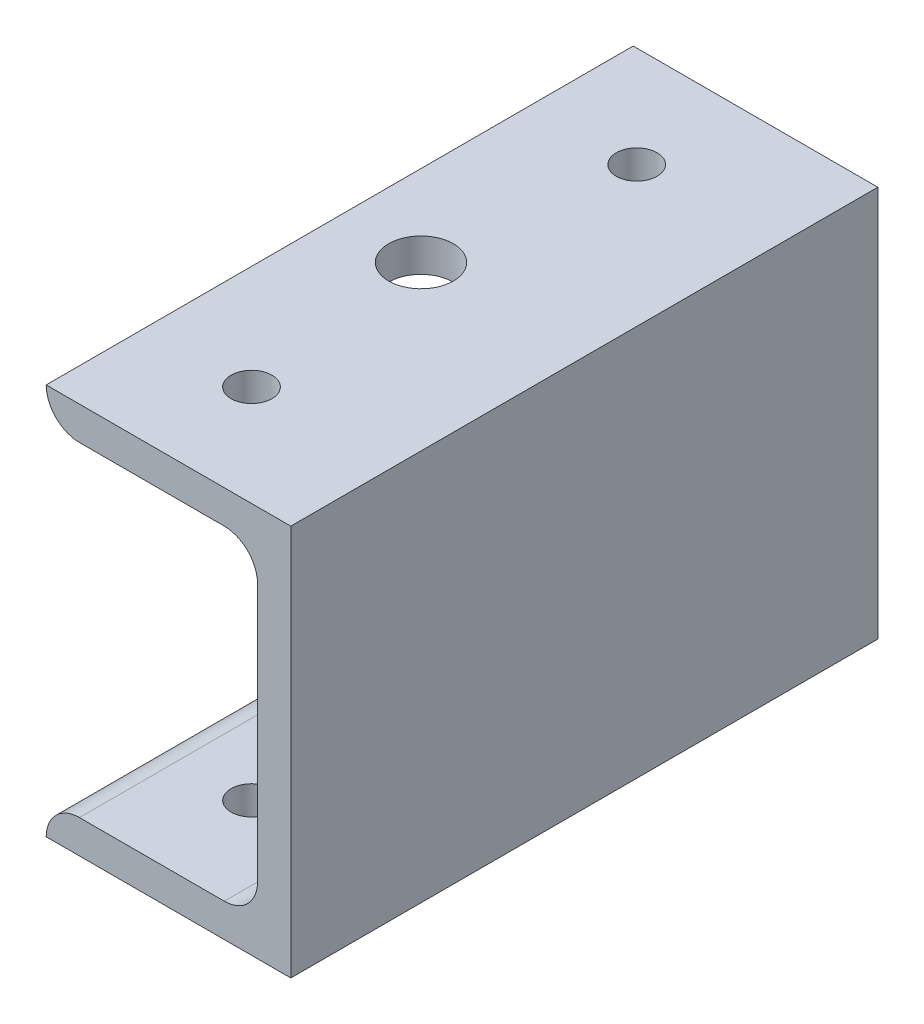
ISO-10303-21;
HEADER;
FILE_DESCRIPTION(('STEP AP214'),'2;1');
FILE_NAME('part.step','',(''),(''),'','','');
FILE_SCHEMA(('AUTOMOTIVE_DESIGN { 1 0 10303 214 1 1 1 1 }'));
ENDSEC;
DATA;
#1=APPLICATION_CONTEXT('core data for automotive mechanical design processes');
#2=APPLICATION_PROTOCOL_DEFINITION('international standard','automotive_design',2000,#1);
#3=PRODUCT_CONTEXT('',#1,'mechanical');
#4=PRODUCT('Part','Part','',(#3));
#5=PRODUCT_RELATED_PRODUCT_CATEGORY('part','',(#4));
#6=PRODUCT_DEFINITION_FORMATION('','',#4);
#7=PRODUCT_DEFINITION_CONTEXT('part definition',#1,'design');
#8=PRODUCT_DEFINITION('design','',#6,#7);
#9=PRODUCT_DEFINITION_SHAPE('','',#8);
#10=(LENGTH_UNIT() NAMED_UNIT(*) SI_UNIT(.MILLI.,.METRE.));
#11=(NAMED_UNIT(*) PLANE_ANGLE_UNIT() SI_UNIT($,.RADIAN.));
#12=(NAMED_UNIT(*) SI_UNIT($,.STERADIAN.) SOLID_ANGLE_UNIT());
#13=UNCERTAINTY_MEASURE_WITH_UNIT(LENGTH_MEASURE(1.E-05),#10,'distance_accuracy_value','');
#14=(GEOMETRIC_REPRESENTATION_CONTEXT(3) GLOBAL_UNCERTAINTY_ASSIGNED_CONTEXT((#13)) GLOBAL_UNIT_ASSIGNED_CONTEXT((#10,
#11,#12)) REPRESENTATION_CONTEXT('',''));
#15=CARTESIAN_POINT('',(0.,0.,0.));
#16=DIRECTION('',(0.,0.,1.));
#17=DIRECTION('',(1.,0.,0.));
#18=AXIS2_PLACEMENT_3D('',#15,#16,#17);
#19=CARTESIAN_POINT('',(-101.6,-100.710476364399,38.1));
#20=DIRECTION('',(0.,1.,0.));
#21=DIRECTION('',(-1.,0.,0.));
#22=AXIS2_PLACEMENT_3D('',#19,#20,#21);
#23=PLANE('',#22);
#24=CARTESIAN_POINT('',(-88.05,-100.710476364399,-25.));
#25=DIRECTION('',(0.,-1.,0.));
#26=DIRECTION('',(0.,0.,-1.));
#27=AXIS2_PLACEMENT_3D('',#24,#25,#26);
#28=CIRCLE('',#27,2.64999999999999);
#29=CARTESIAN_POINT('',(-88.05,-100.710476364399,-27.65));
#30=VERTEX_POINT('',#29);
#31=EDGE_CURVE('E249',#30,#30,#28,.T.);
#32=ORIENTED_EDGE('',*,*,#31,.F.);
#33=EDGE_LOOP('',(#32));
#34=FACE_BOUND('',#33,.T.);
#35=CARTESIAN_POINT('',(-88.05,-100.710476364399,25.));
#36=DIRECTION('',(0.,-1.,0.));
#37=DIRECTION('',(0.,0.,-1.));
#38=AXIS2_PLACEMENT_3D('',#35,#36,#37);
#39=CIRCLE('',#38,2.64999999999999);
#40=CARTESIAN_POINT('',(-88.05,-100.710476364399,22.35));
#41=VERTEX_POINT('',#40);
#42=EDGE_CURVE('E243',#41,#41,#39,.T.);
#43=ORIENTED_EDGE('',*,*,#42,.F.);
#44=EDGE_LOOP('',(#43));
#45=FACE_BOUND('',#44,.T.);
#46=CARTESIAN_POINT('',(-91.05,-100.710476364399,0.));
#47=DIRECTION('',(0.,-1.,0.));
#48=DIRECTION('',(0.,0.,-1.));
#49=AXIS2_PLACEMENT_3D('',#46,#47,#48);
#50=CIRCLE('',#49,2.64999999999999);
#51=CARTESIAN_POINT('',(-91.05,-100.710476364399,-2.64999999999995));
#52=VERTEX_POINT('',#51);
#53=EDGE_CURVE('E237',#52,#52,#50,.T.);
#54=ORIENTED_EDGE('',*,*,#53,.F.);
#55=EDGE_LOOP('',(#54));
#56=FACE_BOUND('',#55,.T.);
#57=DIRECTION('',(1.,0.,0.));
#58=VECTOR('',#57,1.);
#59=CARTESIAN_POINT('',(-101.6,-100.710476364399,-38.1));
#60=LINE('',#59,#58);
#61=CARTESIAN_POINT('',(-101.6,-100.710476364399,-38.1));
#62=VERTEX_POINT('',#61);
#63=CARTESIAN_POINT('',(-69.85,-100.710476364399,-38.1));
#64=VERTEX_POINT('',#63);
#65=EDGE_CURVE('E184',#62,#64,#60,.T.);
#66=ORIENTED_EDGE('',*,*,#65,.T.);
#67=DIRECTION('',(0.,0.,-1.));
#68=VECTOR('',#67,1.);
#69=CARTESIAN_POINT('',(-69.85,-100.710476364399,38.1));
#70=LINE('',#69,#68);
#71=CARTESIAN_POINT('',(-69.85,-100.710476364399,38.1));
#72=VERTEX_POINT('',#71);
#73=EDGE_CURVE('E125',#72,#64,#70,.T.);
#74=ORIENTED_EDGE('',*,*,#73,.F.);
#75=DIRECTION('',(1.,0.,0.));
#76=VECTOR('',#75,1.);
#77=CARTESIAN_POINT('',(-101.6,-100.710476364399,38.1));
#78=LINE('',#77,#76);
#79=CARTESIAN_POINT('',(-101.6,-100.710476364399,38.1));
#80=VERTEX_POINT('',#79);
#81=EDGE_CURVE('E113',#80,#72,#78,.T.);
#82=ORIENTED_EDGE('',*,*,#81,.F.);
#83=DIRECTION('',(0.,0.,-1.));
#84=VECTOR('',#83,1.);
#85=CARTESIAN_POINT('',(-101.6,-100.710476364399,38.1));
#86=LINE('',#85,#84);
#87=EDGE_CURVE('E123',#80,#62,#86,.T.);
#88=ORIENTED_EDGE('',*,*,#87,.T.);
#89=EDGE_LOOP('',(#66,#74,#82,#88));
#90=FACE_BOUND('',#89,.T.);
#91=ADVANCED_FACE('F35',(#34,#45,#56,#90),#23,.F.);
#92=CARTESIAN_POINT('',(-69.85,-100.710476364399,38.1));
#93=DIRECTION('',(-1.,0.,0.));
#94=DIRECTION('',(0.,-1.,0.));
#95=AXIS2_PLACEMENT_3D('',#92,#93,#94);
#96=PLANE('',#95);
#97=DIRECTION('',(0.,1.,0.));
#98=VECTOR('',#97,1.);
#99=CARTESIAN_POINT('',(-69.85,-100.710476364399,-38.1));
#100=LINE('',#99,#98);
#101=CARTESIAN_POINT('',(-69.85,-49.9104763643993,-38.1));
#102=VERTEX_POINT('',#101);
#103=EDGE_CURVE('E186',#64,#102,#100,.T.);
#104=ORIENTED_EDGE('',*,*,#103,.T.);
#105=DIRECTION('',(0.,0.,-1.));
#106=VECTOR('',#105,1.);
#107=CARTESIAN_POINT('',(-69.85,-49.9104763643993,38.1));
#108=LINE('',#107,#106);
#109=CARTESIAN_POINT('',(-69.85,-49.9104763643993,38.1));
#110=VERTEX_POINT('',#109);
#111=EDGE_CURVE('E137',#110,#102,#108,.T.);
#112=ORIENTED_EDGE('',*,*,#111,.F.);
#113=DIRECTION('',(0.,1.,0.));
#114=VECTOR('',#113,1.);
#115=CARTESIAN_POINT('',(-69.85,-100.710476364399,38.1));
#116=LINE('',#115,#114);
#117=EDGE_CURVE('E127',#72,#110,#116,.T.);
#118=ORIENTED_EDGE('',*,*,#117,.F.);
#119=ORIENTED_EDGE('',*,*,#73,.T.);
#120=EDGE_LOOP('',(#104,#112,#118,#119));
#121=FACE_BOUND('',#120,.T.);
#122=ADVANCED_FACE('F257',(#121),#96,.F.);
#123=CARTESIAN_POINT('',(-69.85,-49.9104763643993,38.1));
#124=DIRECTION('',(0.,-1.,0.));
#125=DIRECTION('',(0.,0.,-1.));
#126=AXIS2_PLACEMENT_3D('',#123,#124,#125);
#127=PLANE('',#126);
#128=CARTESIAN_POINT('',(-88.05,-49.9104763643993,25.));
#129=DIRECTION('',(0.,1.,0.));
#130=DIRECTION('',(0.,0.,1.));
#131=AXIS2_PLACEMENT_3D('',#128,#129,#130);
#132=CIRCLE('',#131,2.64999999999999);
#133=CARTESIAN_POINT('',(-88.05,-49.9104763643993,27.65));
#134=VERTEX_POINT('',#133);
#135=EDGE_CURVE('E231',#134,#134,#132,.T.);
#136=ORIENTED_EDGE('',*,*,#135,.F.);
#137=EDGE_LOOP('',(#136));
#138=FACE_BOUND('',#137,.T.);
#139=CARTESIAN_POINT('',(-88.05,-49.9104763643993,-25.));
#140=DIRECTION('',(0.,1.,0.));
#141=DIRECTION('',(0.,0.,1.));
#142=AXIS2_PLACEMENT_3D('',#139,#140,#141);
#143=CIRCLE('',#142,2.64999999999999);
#144=CARTESIAN_POINT('',(-88.05,-49.9104763643993,-22.35));
#145=VERTEX_POINT('',#144);
#146=EDGE_CURVE('E225',#145,#145,#143,.T.);
#147=ORIENTED_EDGE('',*,*,#146,.F.);
#148=EDGE_LOOP('',(#147));
#149=FACE_BOUND('',#148,.T.);
#150=CARTESIAN_POINT('',(-91.05,-49.9104763643993,0.));
#151=DIRECTION('',(0.,-1.,0.));
#152=DIRECTION('',(0.,0.,-1.));
#153=AXIS2_PLACEMENT_3D('',#150,#151,#152);
#154=CIRCLE('',#153,4.2);
#155=CARTESIAN_POINT('',(-91.05,-49.9104763643993,4.19999999999999));
#156=VERTEX_POINT('',#155);
#157=EDGE_CURVE('E187',#156,#156,#154,.T.);
#158=ORIENTED_EDGE('',*,*,#157,.T.);
#159=EDGE_LOOP('',(#158));
#160=FACE_BOUND('',#159,.T.);
#161=DIRECTION('',(-1.,0.,0.));
#162=VECTOR('',#161,1.);
#163=CARTESIAN_POINT('',(-69.85,-49.9104763643993,-38.1));
#164=LINE('',#163,#162);
#165=CARTESIAN_POINT('',(-101.6,-49.9104763643993,-38.1));
#166=VERTEX_POINT('',#165);
#167=EDGE_CURVE('E189',#102,#166,#164,.T.);
#168=ORIENTED_EDGE('',*,*,#167,.T.);
#169=DIRECTION('',(0.,0.,-1.));
#170=VECTOR('',#169,1.);
#171=CARTESIAN_POINT('',(-101.6,-49.9104763643993,38.1));
#172=LINE('',#171,#170);
#173=CARTESIAN_POINT('',(-101.6,-49.9104763643993,38.1));
#174=VERTEX_POINT('',#173);
#175=EDGE_CURVE('E175',#174,#166,#172,.T.);
#176=ORIENTED_EDGE('',*,*,#175,.F.);
#177=DIRECTION('',(-1.,0.,0.));
#178=VECTOR('',#177,1.);
#179=CARTESIAN_POINT('',(-69.85,-49.9104763643993,38.1));
#180=LINE('',#179,#178);
#181=EDGE_CURVE('E201',#110,#174,#180,.T.);
#182=ORIENTED_EDGE('',*,*,#181,.F.);
#183=ORIENTED_EDGE('',*,*,#111,.T.);
#184=EDGE_LOOP('',(#168,#176,#182,#183));
#185=FACE_BOUND('',#184,.T.);
#186=ADVANCED_FACE('F199',(#138,#149,#160,#185),#127,.F.);
#187=CARTESIAN_POINT('',(-74.168,-54.2284763643993,38.1));
#188=DIRECTION('',(0.,1.,0.));
#189=DIRECTION('',(-1.,0.,0.));
#190=AXIS2_PLACEMENT_3D('',#187,#188,#189);
#191=PLANE('',#190);
#192=CARTESIAN_POINT('',(-88.05,-54.2284763643993,25.));
#193=DIRECTION('',(0.,1.,0.));
#194=DIRECTION('',(0.,0.,1.));
#195=AXIS2_PLACEMENT_3D('',#192,#193,#194);
#196=CIRCLE('',#195,2.64999999999999);
#197=CARTESIAN_POINT('',(-88.05,-54.2284763643993,27.65));
#198=VERTEX_POINT('',#197);
#199=EDGE_CURVE('E228',#198,#198,#196,.T.);
#200=ORIENTED_EDGE('',*,*,#199,.T.);
#201=EDGE_LOOP('',(#200));
#202=FACE_BOUND('',#201,.T.);
#203=CARTESIAN_POINT('',(-88.05,-54.2284763643993,-25.));
#204=DIRECTION('',(0.,1.,0.));
#205=DIRECTION('',(0.,0.,1.));
#206=AXIS2_PLACEMENT_3D('',#203,#204,#205);
#207=CIRCLE('',#206,2.64999999999999);
#208=CARTESIAN_POINT('',(-88.05,-54.2284763643993,-22.35));
#209=VERTEX_POINT('',#208);
#210=EDGE_CURVE('E222',#209,#209,#207,.T.);
#211=ORIENTED_EDGE('',*,*,#210,.T.);
#212=EDGE_LOOP('',(#211));
#213=FACE_BOUND('',#212,.T.);
#214=CARTESIAN_POINT('',(-91.05,-54.2284763643993,0.));
#215=DIRECTION('',(0.,1.,0.));
#216=DIRECTION('',(-1.,0.,0.));
#217=AXIS2_PLACEMENT_3D('',#214,#215,#216);
#218=CIRCLE('',#217,4.2);
#219=CARTESIAN_POINT('',(-91.05,-54.2284763643993,4.19999999999999));
#220=VERTEX_POINT('',#219);
#221=EDGE_CURVE('E219',#220,#220,#218,.F.);
#222=ORIENTED_EDGE('',*,*,#221,.F.);
#223=EDGE_LOOP('',(#222));
#224=FACE_BOUND('',#223,.T.);
#225=DIRECTION('',(1.,0.,0.));
#226=VECTOR('',#225,1.);
#227=CARTESIAN_POINT('',(-74.168,-54.2284763643993,38.1));
#228=LINE('',#227,#226);
#229=CARTESIAN_POINT('',(-97.282,-54.2284763643993,38.1));
#230=VERTEX_POINT('',#229);
#231=CARTESIAN_POINT('',(-78.486,-54.2284763643993,38.1));
#232=VERTEX_POINT('',#231);
#233=EDGE_CURVE('E180',#230,#232,#228,.T.);
#234=ORIENTED_EDGE('',*,*,#233,.F.);
#235=DIRECTION('',(0.,0.,-1.));
#236=VECTOR('',#235,1.);
#237=CARTESIAN_POINT('',(-97.282,-54.2284763643993,38.1));
#238=LINE('',#237,#236);
#239=CARTESIAN_POINT('',(-97.282,-54.2284763643993,-38.1));
#240=VERTEX_POINT('',#239);
#241=EDGE_CURVE('E135',#230,#240,#238,.T.);
#242=ORIENTED_EDGE('',*,*,#241,.T.);
#243=DIRECTION('',(1.,0.,0.));
#244=VECTOR('',#243,1.);
#245=CARTESIAN_POINT('',(-74.168,-54.2284763643993,-38.1));
#246=LINE('',#245,#244);
#247=CARTESIAN_POINT('',(-78.486,-54.2284763643993,-38.1));
#248=VERTEX_POINT('',#247);
#249=EDGE_CURVE('E172',#240,#248,#246,.T.);
#250=ORIENTED_EDGE('',*,*,#249,.T.);
#251=DIRECTION('',(0.,0.,-1.));
#252=VECTOR('',#251,1.);
#253=CARTESIAN_POINT('',(-78.486,-54.2284763643993,38.1));
#254=LINE('',#253,#252);
#255=EDGE_CURVE('E133',#248,#232,#254,.F.);
#256=ORIENTED_EDGE('',*,*,#255,.T.);
#257=EDGE_LOOP('',(#234,#242,#250,#256));
#258=FACE_BOUND('',#257,.T.);
#259=ADVANCED_FACE('F210',(#202,#213,#224,#258),#191,.F.);
#260=CARTESIAN_POINT('',(-74.168,-96.3924763643993,38.1));
#261=DIRECTION('',(1.,0.,0.));
#262=DIRECTION('',(0.,0.,-1.));
#263=AXIS2_PLACEMENT_3D('',#260,#261,#262);
#264=PLANE('',#263);
#265=DIRECTION('',(0.,-1.,0.));
#266=VECTOR('',#265,1.);
#267=CARTESIAN_POINT('',(-74.168,-96.3924763643993,38.1));
#268=LINE('',#267,#266);
#269=CARTESIAN_POINT('',(-74.168,-58.5464763643993,38.1));
#270=VERTEX_POINT('',#269);
#271=CARTESIAN_POINT('',(-74.168,-92.0744763643993,38.1));
#272=VERTEX_POINT('',#271);
#273=EDGE_CURVE('E176',#270,#272,#268,.T.);
#274=ORIENTED_EDGE('',*,*,#273,.F.);
#275=DIRECTION('',(0.,0.,-1.));
#276=VECTOR('',#275,1.);
#277=CARTESIAN_POINT('',(-74.168,-58.5464763643993,-38.1));
#278=LINE('',#277,#276);
#279=CARTESIAN_POINT('',(-74.168,-58.5464763643993,-38.1));
#280=VERTEX_POINT('',#279);
#281=EDGE_CURVE('E152',#270,#280,#278,.T.);
#282=ORIENTED_EDGE('',*,*,#281,.T.);
#283=DIRECTION('',(0.,-1.,0.));
#284=VECTOR('',#283,1.);
#285=CARTESIAN_POINT('',(-74.168,-96.3924763643993,-38.1));
#286=LINE('',#285,#284);
#287=CARTESIAN_POINT('',(-74.168,-92.0744763643993,-38.1));
#288=VERTEX_POINT('',#287);
#289=EDGE_CURVE('E164',#280,#288,#286,.T.);
#290=ORIENTED_EDGE('',*,*,#289,.T.);
#291=DIRECTION('',(0.,0.,-1.));
#292=VECTOR('',#291,1.);
#293=CARTESIAN_POINT('',(-74.168,-92.0744763643993,38.1));
#294=LINE('',#293,#292);
#295=EDGE_CURVE('E150',#288,#272,#294,.F.);
#296=ORIENTED_EDGE('',*,*,#295,.T.);
#297=EDGE_LOOP('',(#274,#282,#290,#296));
#298=FACE_BOUND('',#297,.T.);
#299=ADVANCED_FACE('F170',(#298),#264,.F.);
#300=CARTESIAN_POINT('',(-101.6,-96.3924763643993,38.1));
#301=DIRECTION('',(0.,-1.,0.));
#302=DIRECTION('',(0.,0.,-1.));
#303=AXIS2_PLACEMENT_3D('',#300,#301,#302);
#304=PLANE('',#303);
#305=CARTESIAN_POINT('',(-88.05,-96.3924763643993,-25.));
#306=DIRECTION('',(0.,-1.,0.));
#307=DIRECTION('',(0.,0.,-1.));
#308=AXIS2_PLACEMENT_3D('',#305,#306,#307);
#309=CIRCLE('',#308,2.64999999999999);
#310=CARTESIAN_POINT('',(-88.05,-96.3924763643993,-27.65));
#311=VERTEX_POINT('',#310);
#312=EDGE_CURVE('E246',#311,#311,#309,.T.);
#313=ORIENTED_EDGE('',*,*,#312,.T.);
#314=EDGE_LOOP('',(#313));
#315=FACE_BOUND('',#314,.T.);
#316=CARTESIAN_POINT('',(-88.05,-96.3924763643993,25.));
#317=DIRECTION('',(0.,-1.,0.));
#318=DIRECTION('',(0.,0.,-1.));
#319=AXIS2_PLACEMENT_3D('',#316,#317,#318);
#320=CIRCLE('',#319,2.64999999999999);
#321=CARTESIAN_POINT('',(-88.05,-96.3924763643993,22.35));
#322=VERTEX_POINT('',#321);
#323=EDGE_CURVE('E240',#322,#322,#320,.T.);
#324=ORIENTED_EDGE('',*,*,#323,.T.);
#325=EDGE_LOOP('',(#324));
#326=FACE_BOUND('',#325,.T.);
#327=CARTESIAN_POINT('',(-91.05,-96.3924763643993,0.));
#328=DIRECTION('',(0.,-1.,0.));
#329=DIRECTION('',(0.,0.,-1.));
#330=AXIS2_PLACEMENT_3D('',#327,#328,#329);
#331=CIRCLE('',#330,2.64999999999999);
#332=CARTESIAN_POINT('',(-91.05,-96.3924763643993,-2.64999999999995));
#333=VERTEX_POINT('',#332);
#334=EDGE_CURVE('E234',#333,#333,#331,.T.);
#335=ORIENTED_EDGE('',*,*,#334,.T.);
#336=EDGE_LOOP('',(#335));
#337=FACE_BOUND('',#336,.T.);
#338=DIRECTION('',(-1.,0.,0.));
#339=VECTOR('',#338,1.);
#340=CARTESIAN_POINT('',(-101.6,-96.3924763643993,-38.1));
#341=LINE('',#340,#339);
#342=CARTESIAN_POINT('',(-78.486,-96.3924763643993,-38.1));
#343=VERTEX_POINT('',#342);
#344=CARTESIAN_POINT('',(-97.282,-96.3924763643993,-38.1));
#345=VERTEX_POINT('',#344);
#346=EDGE_CURVE('E128',#343,#345,#341,.T.);
#347=ORIENTED_EDGE('',*,*,#346,.T.);
#348=DIRECTION('',(0.,0.,-1.));
#349=VECTOR('',#348,1.);
#350=CARTESIAN_POINT('',(-97.282,-96.3924763643993,38.1));
#351=LINE('',#350,#349);
#352=CARTESIAN_POINT('',(-97.282,-96.3924763643993,38.1));
#353=VERTEX_POINT('',#352);
#354=EDGE_CURVE('E50',#345,#353,#351,.F.);
#355=ORIENTED_EDGE('',*,*,#354,.T.);
#356=DIRECTION('',(-1.,0.,0.));
#357=VECTOR('',#356,1.);
#358=CARTESIAN_POINT('',(-101.6,-96.3924763643993,38.1));
#359=LINE('',#358,#357);
#360=CARTESIAN_POINT('',(-78.486,-96.3924763643993,38.1));
#361=VERTEX_POINT('',#360);
#362=EDGE_CURVE('E115',#361,#353,#359,.T.);
#363=ORIENTED_EDGE('',*,*,#362,.F.);
#364=DIRECTION('',(0.,0.,-1.));
#365=VECTOR('',#364,1.);
#366=CARTESIAN_POINT('',(-78.486,-96.3924763643993,-38.1));
#367=LINE('',#366,#365);
#368=EDGE_CURVE('E146',#361,#343,#367,.T.);
#369=ORIENTED_EDGE('',*,*,#368,.T.);
#370=EDGE_LOOP('',(#347,#355,#363,#369));
#371=FACE_BOUND('',#370,.T.);
#372=ADVANCED_FACE('F174',(#315,#326,#337,#371),#304,.F.);
#373=CARTESIAN_POINT('',(0.,0.,38.1));
#374=DIRECTION('',(0.,0.,-1.));
#375=DIRECTION('',(-1.,0.,0.));
#376=AXIS2_PLACEMENT_3D('',#373,#374,#375);
#377=PLANE('',#376);
#378=ORIENTED_EDGE('',*,*,#181,.T.);
#379=CARTESIAN_POINT('',(-97.282,-49.9104763643993,38.1));
#380=DIRECTION('',(0.,0.,-1.));
#381=DIRECTION('',(-1.,0.,0.));
#382=AXIS2_PLACEMENT_3D('',#379,#380,#381);
#383=CIRCLE('',#382,4.318);
#384=EDGE_CURVE('E118',#174,#230,#383,.F.);
#385=ORIENTED_EDGE('',*,*,#384,.T.);
#386=ORIENTED_EDGE('',*,*,#233,.T.);
#387=CARTESIAN_POINT('',(-78.486,-58.5464763643993,38.1));
#388=DIRECTION('',(0.,0.,-1.));
#389=DIRECTION('',(-1.,0.,0.));
#390=AXIS2_PLACEMENT_3D('',#387,#388,#389);
#391=CIRCLE('',#390,4.318);
#392=EDGE_CURVE('E157',#232,#270,#391,.T.);
#393=ORIENTED_EDGE('',*,*,#392,.T.);
#394=ORIENTED_EDGE('',*,*,#273,.T.);
#395=CARTESIAN_POINT('',(-78.486,-92.0744763643993,38.1));
#396=DIRECTION('',(0.,0.,-1.));
#397=DIRECTION('',(-1.,0.,0.));
#398=AXIS2_PLACEMENT_3D('',#395,#396,#397);
#399=CIRCLE('',#398,4.318);
#400=EDGE_CURVE('E11',#272,#361,#399,.T.);
#401=ORIENTED_EDGE('',*,*,#400,.T.);
#402=ORIENTED_EDGE('',*,*,#362,.T.);
#403=CARTESIAN_POINT('',(-97.282,-100.710476364399,38.1));
#404=DIRECTION('',(0.,0.,-1.));
#405=DIRECTION('',(-1.,0.,0.));
#406=AXIS2_PLACEMENT_3D('',#403,#404,#405);
#407=CIRCLE('',#406,4.318);
#408=EDGE_CURVE('E110',#353,#80,#407,.F.);
#409=ORIENTED_EDGE('',*,*,#408,.T.);
#410=ORIENTED_EDGE('',*,*,#81,.T.);
#411=ORIENTED_EDGE('',*,*,#117,.T.);
#412=EDGE_LOOP('',(#378,#385,#386,#393,#394,#401,#402,#409,#410,#411));
#413=FACE_BOUND('',#412,.T.);
#414=ADVANCED_FACE('F112',(#413),#377,.F.);
#415=CARTESIAN_POINT('',(0.,0.,-38.1));
#416=DIRECTION('',(0.,0.,-1.));
#417=DIRECTION('',(-1.,0.,0.));
#418=AXIS2_PLACEMENT_3D('',#415,#416,#417);
#419=PLANE('',#418);
#420=ORIENTED_EDGE('',*,*,#249,.F.);
#421=CARTESIAN_POINT('',(-97.282,-49.9104763643993,-38.1));
#422=DIRECTION('',(0.,0.,-1.));
#423=DIRECTION('',(-1.,0.,0.));
#424=AXIS2_PLACEMENT_3D('',#421,#422,#423);
#425=CIRCLE('',#424,4.318);
#426=EDGE_CURVE('E119',#240,#166,#425,.T.);
#427=ORIENTED_EDGE('',*,*,#426,.T.);
#428=ORIENTED_EDGE('',*,*,#167,.F.);
#429=ORIENTED_EDGE('',*,*,#103,.F.);
#430=ORIENTED_EDGE('',*,*,#65,.F.);
#431=CARTESIAN_POINT('',(-97.282,-100.710476364399,-38.1));
#432=DIRECTION('',(0.,0.,-1.));
#433=DIRECTION('',(-1.,0.,0.));
#434=AXIS2_PLACEMENT_3D('',#431,#432,#433);
#435=CIRCLE('',#434,4.318);
#436=EDGE_CURVE('E131',#62,#345,#435,.T.);
#437=ORIENTED_EDGE('',*,*,#436,.T.);
#438=ORIENTED_EDGE('',*,*,#346,.F.);
#439=CARTESIAN_POINT('',(-78.486,-92.0744763643993,-38.1));
#440=DIRECTION('',(0.,0.,-1.));
#441=DIRECTION('',(-1.,0.,0.));
#442=AXIS2_PLACEMENT_3D('',#439,#440,#441);
#443=CIRCLE('',#442,4.318);
#444=EDGE_CURVE('E43',#343,#288,#443,.F.);
#445=ORIENTED_EDGE('',*,*,#444,.T.);
#446=ORIENTED_EDGE('',*,*,#289,.F.);
#447=CARTESIAN_POINT('',(-78.486,-58.5464763643993,-38.1));
#448=DIRECTION('',(0.,0.,-1.));
#449=DIRECTION('',(-1.,0.,0.));
#450=AXIS2_PLACEMENT_3D('',#447,#448,#449);
#451=CIRCLE('',#450,4.318);
#452=EDGE_CURVE('E155',#280,#248,#451,.F.);
#453=ORIENTED_EDGE('',*,*,#452,.T.);
#454=EDGE_LOOP('',(#420,#427,#428,#429,#430,#437,#438,#445,#446,#453));
#455=FACE_BOUND('',#454,.T.);
#456=ADVANCED_FACE('F163',(#455),#419,.T.);
#457=CARTESIAN_POINT('',(-97.282,-49.9104763643993,38.1));
#458=DIRECTION('',(0.,0.,-1.));
#459=DIRECTION('',(-1.,0.,0.));
#460=AXIS2_PLACEMENT_3D('',#457,#458,#459);
#461=CYLINDRICAL_SURFACE('',#460,4.318);
#462=ORIENTED_EDGE('',*,*,#384,.F.);
#463=ORIENTED_EDGE('',*,*,#175,.T.);
#464=ORIENTED_EDGE('',*,*,#426,.F.);
#465=ORIENTED_EDGE('',*,*,#241,.F.);
#466=EDGE_LOOP('',(#462,#463,#464,#465));
#467=FACE_BOUND('',#466,.T.);
#468=ADVANCED_FACE('F207',(#467),#461,.T.);
#469=CARTESIAN_POINT('',(-97.282,-100.710476364399,38.1));
#470=DIRECTION('',(0.,0.,-1.));
#471=DIRECTION('',(-1.,0.,0.));
#472=AXIS2_PLACEMENT_3D('',#469,#470,#471);
#473=CYLINDRICAL_SURFACE('',#472,4.318);
#474=ORIENTED_EDGE('',*,*,#408,.F.);
#475=ORIENTED_EDGE('',*,*,#354,.F.);
#476=ORIENTED_EDGE('',*,*,#436,.F.);
#477=ORIENTED_EDGE('',*,*,#87,.F.);
#478=EDGE_LOOP('',(#474,#475,#476,#477));
#479=FACE_BOUND('',#478,.T.);
#480=ADVANCED_FACE('F130',(#479),#473,.T.);
#481=CARTESIAN_POINT('',(-78.486,-58.5464763643993,38.1));
#482=DIRECTION('',(0.,0.,1.));
#483=DIRECTION('',(1.,0.,0.));
#484=AXIS2_PLACEMENT_3D('',#481,#482,#483);
#485=CYLINDRICAL_SURFACE('',#484,4.318);
#486=ORIENTED_EDGE('',*,*,#392,.F.);
#487=ORIENTED_EDGE('',*,*,#255,.F.);
#488=ORIENTED_EDGE('',*,*,#452,.F.);
#489=ORIENTED_EDGE('',*,*,#281,.F.);
#490=EDGE_LOOP('',(#486,#487,#488,#489));
#491=FACE_BOUND('',#490,.T.);
#492=ADVANCED_FACE('F308',(#491),#485,.F.);
#493=CARTESIAN_POINT('',(-78.486,-92.0744763643993,38.1));
#494=DIRECTION('',(0.,0.,1.));
#495=DIRECTION('',(1.,0.,0.));
#496=AXIS2_PLACEMENT_3D('',#493,#494,#495);
#497=CYLINDRICAL_SURFACE('',#496,4.318);
#498=ORIENTED_EDGE('',*,*,#400,.F.);
#499=ORIENTED_EDGE('',*,*,#295,.F.);
#500=ORIENTED_EDGE('',*,*,#444,.F.);
#501=ORIENTED_EDGE('',*,*,#368,.F.);
#502=EDGE_LOOP('',(#498,#499,#500,#501));
#503=FACE_BOUND('',#502,.T.);
#504=ADVANCED_FACE('F37',(#503),#497,.F.);
#505=CARTESIAN_POINT('',(-91.05,-43.5604763643993,0.));
#506=DIRECTION('',(0.,1.,0.));
#507=DIRECTION('',(0.,0.,1.));
#508=AXIS2_PLACEMENT_3D('',#505,#506,#507);
#509=CYLINDRICAL_SURFACE('',#508,4.2);
#510=CARTESIAN_POINT('',(-91.05,-54.2284763643993,4.19999999999999));
#511=CARTESIAN_POINT('',(-91.05,-54.1834971977327,4.19999999999999));
#512=CARTESIAN_POINT('',(-91.05,-54.138518031066,4.19999999999999));
#513=CARTESIAN_POINT('',(-91.05,-54.0485596977327,4.19999999999999));
#514=CARTESIAN_POINT('',(-91.05,-54.003580531066,4.19999999999999));
#515=CARTESIAN_POINT('',(-91.05,-53.9136221977327,4.19999999999999));
#516=CARTESIAN_POINT('',(-91.05,-53.868643031066,4.19999999999999));
#517=CARTESIAN_POINT('',(-91.05,-53.7786846977327,4.19999999999999));
#518=CARTESIAN_POINT('',(-91.05,-53.733705531066,4.19999999999999));
#519=CARTESIAN_POINT('',(-91.05,-53.6437471977327,4.19999999999999));
#520=CARTESIAN_POINT('',(-91.05,-53.598768031066,4.19999999999999));
#521=CARTESIAN_POINT('',(-91.05,-53.5088096977327,4.19999999999999));
#522=CARTESIAN_POINT('',(-91.05,-53.463830531066,4.19999999999999));
#523=CARTESIAN_POINT('',(-91.05,-53.3738721977327,4.19999999999999));
#524=CARTESIAN_POINT('',(-91.05,-53.328893031066,4.19999999999999));
#525=CARTESIAN_POINT('',(-91.05,-53.2389346977327,4.19999999999999));
#526=CARTESIAN_POINT('',(-91.05,-53.193955531066,4.19999999999999));
#527=CARTESIAN_POINT('',(-91.05,-53.1039971977327,4.19999999999999));
#528=CARTESIAN_POINT('',(-91.05,-53.059018031066,4.19999999999999));
#529=CARTESIAN_POINT('',(-91.05,-52.9690596977327,4.19999999999999));
#530=CARTESIAN_POINT('',(-91.05,-52.924080531066,4.19999999999999));
#531=CARTESIAN_POINT('',(-91.05,-52.8341221977327,4.19999999999999));
#532=CARTESIAN_POINT('',(-91.05,-52.789143031066,4.19999999999999));
#533=CARTESIAN_POINT('',(-91.05,-52.6991846977327,4.19999999999999));
#534=CARTESIAN_POINT('',(-91.05,-52.654205531066,4.19999999999999));
#535=CARTESIAN_POINT('',(-91.05,-52.5642471977327,4.19999999999999));
#536=CARTESIAN_POINT('',(-91.05,-52.519268031066,4.19999999999999));
#537=CARTESIAN_POINT('',(-91.05,-52.4293096977327,4.19999999999999));
#538=CARTESIAN_POINT('',(-91.05,-52.384330531066,4.19999999999999));
#539=CARTESIAN_POINT('',(-91.05,-52.2943721977327,4.19999999999999));
#540=CARTESIAN_POINT('',(-91.05,-52.249393031066,4.19999999999999));
#541=CARTESIAN_POINT('',(-91.05,-52.1594346977327,4.19999999999999));
#542=CARTESIAN_POINT('',(-91.05,-52.114455531066,4.19999999999999));
#543=CARTESIAN_POINT('',(-91.05,-52.0244971977327,4.19999999999999));
#544=CARTESIAN_POINT('',(-91.05,-51.979518031066,4.19999999999999));
#545=CARTESIAN_POINT('',(-91.05,-51.8895596977327,4.19999999999999));
#546=CARTESIAN_POINT('',(-91.05,-51.844580531066,4.19999999999999));
#547=CARTESIAN_POINT('',(-91.05,-51.7546221977327,4.19999999999999));
#548=CARTESIAN_POINT('',(-91.05,-51.709643031066,4.19999999999999));
#549=CARTESIAN_POINT('',(-91.05,-51.6196846977327,4.19999999999999));
#550=CARTESIAN_POINT('',(-91.05,-51.574705531066,4.19999999999999));
#551=CARTESIAN_POINT('',(-91.05,-51.4847471977327,4.19999999999999));
#552=CARTESIAN_POINT('',(-91.05,-51.439768031066,4.19999999999999));
#553=CARTESIAN_POINT('',(-91.05,-51.3498096977327,4.19999999999999));
#554=CARTESIAN_POINT('',(-91.05,-51.304830531066,4.19999999999999));
#555=CARTESIAN_POINT('',(-91.05,-51.2148721977327,4.19999999999999));
#556=CARTESIAN_POINT('',(-91.05,-51.169893031066,4.19999999999999));
#557=CARTESIAN_POINT('',(-91.05,-51.0799346977327,4.19999999999999));
#558=CARTESIAN_POINT('',(-91.05,-51.034955531066,4.19999999999999));
#559=CARTESIAN_POINT('',(-91.05,-50.9449971977327,4.19999999999999));
#560=CARTESIAN_POINT('',(-91.05,-50.900018031066,4.19999999999999));
#561=CARTESIAN_POINT('',(-91.05,-50.8100596977327,4.19999999999999));
#562=CARTESIAN_POINT('',(-91.05,-50.765080531066,4.19999999999999));
#563=CARTESIAN_POINT('',(-91.05,-50.6751221977327,4.19999999999999));
#564=CARTESIAN_POINT('',(-91.05,-50.630143031066,4.19999999999999));
#565=CARTESIAN_POINT('',(-91.05,-50.5401846977327,4.19999999999999));
#566=CARTESIAN_POINT('',(-91.05,-50.495205531066,4.19999999999999));
#567=CARTESIAN_POINT('',(-91.05,-50.4052471977327,4.19999999999999));
#568=CARTESIAN_POINT('',(-91.05,-50.360268031066,4.19999999999999));
#569=CARTESIAN_POINT('',(-91.05,-50.2703096977327,4.19999999999999));
#570=CARTESIAN_POINT('',(-91.05,-50.225330531066,4.19999999999999));
#571=CARTESIAN_POINT('',(-91.05,-50.1353721977327,4.19999999999999));
#572=CARTESIAN_POINT('',(-91.05,-50.090393031066,4.19999999999999));
#573=CARTESIAN_POINT('',(-91.05,-50.0004346977327,4.19999999999999));
#574=CARTESIAN_POINT('',(-91.05,-49.955455531066,4.19999999999999));
#575=CARTESIAN_POINT('',(-91.05,-49.9104763643993,4.19999999999999));
#576=B_SPLINE_CURVE_WITH_KNOTS('',3,(#510,#511,#512,#513,#514,#515,#516,#517,#518,#519,#520,
#521,#522,#523,#524,#525,#526,#527,#528,#529,#530,#531,#532,#533,#534,#535,#536,#537,#538,#539,
#540,#541,#542,#543,#544,#545,#546,#547,#548,#549,#550,#551,#552,#553,#554,#555,#556,#557,#558,
#559,#560,#561,#562,#563,#564,#565,#566,#567,#568,#569,#570,#571,#572,#573,#574,#575),
.UNSPECIFIED.,.F.,.F.,(4,2,2,2,2,2,2,2,2,2,2,2,2,2,2,2,2,2,2,2,2,2,2,2,2,2,2,2,2,2,2,2,4),(0.,
0.134937499999994,0.269874999999996,0.404812499999997,0.539749999999999,0.6746875,
0.809624999999994,0.944562499999996,1.0795,1.2144375,1.349375,1.4843125,1.61925,1.7541875,
1.889125,2.0240625,2.159,2.2939375,2.428875,2.5638125,2.69875,2.8336875,2.968625,3.1035625,
3.23850000000001,3.37343750000001,3.50837500000001,3.6433125,3.77825,3.91318750000001,
4.04812500000001,4.18306250000001,4.318),.UNSPECIFIED.);
#577=EDGE_CURVE('BSEAM283',#220,#156,#576,.T.);
#578=ORIENTED_EDGE('',*,*,#221,.T.);
#579=ORIENTED_EDGE('',*,*,#157,.F.);
#580=ORIENTED_EDGE('',*,*,#577,.T.);
#581=ORIENTED_EDGE('',*,*,#577,.F.);
#582=EDGE_LOOP('',(#578,#580,#579,#581));
#583=FACE_BOUND('',#582,.T.);
#584=ADVANCED_FACE('F283',(#583),#509,.F.);
#585=CARTESIAN_POINT('',(-88.05,-49.9104763643993,-25.));
#586=DIRECTION('',(0.,1.,0.));
#587=DIRECTION('',(0.,0.,1.));
#588=AXIS2_PLACEMENT_3D('',#585,#586,#587);
#589=CYLINDRICAL_SURFACE('',#588,2.64999999999999);
#590=ORIENTED_EDGE('',*,*,#210,.F.);
#591=EDGE_LOOP('',(#590));
#592=FACE_BOUND('',#591,.T.);
#593=ORIENTED_EDGE('',*,*,#146,.T.);
#594=EDGE_LOOP('',(#593));
#595=FACE_BOUND('',#594,.T.);
#596=ADVANCED_FACE('F275',(#592,#595),#589,.F.);
#597=CARTESIAN_POINT('',(-88.05,-49.9104763643993,25.));
#598=DIRECTION('',(0.,1.,0.));
#599=DIRECTION('',(0.,0.,1.));
#600=AXIS2_PLACEMENT_3D('',#597,#598,#599);
#601=CYLINDRICAL_SURFACE('',#600,2.64999999999999);
#602=ORIENTED_EDGE('',*,*,#199,.F.);
#603=EDGE_LOOP('',(#602));
#604=FACE_BOUND('',#603,.T.);
#605=ORIENTED_EDGE('',*,*,#135,.T.);
#606=EDGE_LOOP('',(#605));
#607=FACE_BOUND('',#606,.T.);
#608=ADVANCED_FACE('F266',(#604,#607),#601,.F.);
#609=CARTESIAN_POINT('',(-91.05,-100.710476364399,0.));
#610=DIRECTION('',(0.,-1.,0.));
#611=DIRECTION('',(0.,0.,-1.));
#612=AXIS2_PLACEMENT_3D('',#609,#610,#611);
#613=CYLINDRICAL_SURFACE('',#612,2.64999999999999);
#614=ORIENTED_EDGE('',*,*,#334,.F.);
#615=EDGE_LOOP('',(#614));
#616=FACE_BOUND('',#615,.T.);
#617=ORIENTED_EDGE('',*,*,#53,.T.);
#618=EDGE_LOOP('',(#617));
#619=FACE_BOUND('',#618,.T.);
#620=ADVANCED_FACE('F263',(#616,#619),#613,.F.);
#621=CARTESIAN_POINT('',(-88.05,-100.710476364399,25.));
#622=DIRECTION('',(0.,-1.,0.));
#623=DIRECTION('',(0.,0.,-1.));
#624=AXIS2_PLACEMENT_3D('',#621,#622,#623);
#625=CYLINDRICAL_SURFACE('',#624,2.64999999999999);
#626=ORIENTED_EDGE('',*,*,#323,.F.);
#627=EDGE_LOOP('',(#626));
#628=FACE_BOUND('',#627,.T.);
#629=ORIENTED_EDGE('',*,*,#42,.T.);
#630=EDGE_LOOP('',(#629));
#631=FACE_BOUND('',#630,.T.);
#632=ADVANCED_FACE('F265',(#628,#631),#625,.F.);
#633=CARTESIAN_POINT('',(-88.05,-100.710476364399,-25.));
#634=DIRECTION('',(0.,-1.,0.));
#635=DIRECTION('',(0.,0.,-1.));
#636=AXIS2_PLACEMENT_3D('',#633,#634,#635);
#637=CYLINDRICAL_SURFACE('',#636,2.64999999999999);
#638=ORIENTED_EDGE('',*,*,#312,.F.);
#639=EDGE_LOOP('',(#638));
#640=FACE_BOUND('',#639,.T.);
#641=ORIENTED_EDGE('',*,*,#31,.T.);
#642=EDGE_LOOP('',(#641));
#643=FACE_BOUND('',#642,.T.);
#644=ADVANCED_FACE('F253',(#640,#643),#637,.F.);
#645=CLOSED_SHELL('',(#91,#122,#186,#259,#299,#372,#414,#456,#468,#480,#492,#504,#584,#596,#608,
#620,#632,#644));
#646=MANIFOLD_SOLID_BREP('B2',#645);
#647=ADVANCED_BREP_SHAPE_REPRESENTATION('',(#18,#646),#14);
#648=SHAPE_DEFINITION_REPRESENTATION(#9,#647);
ENDSEC;
END-ISO-10303-21;
